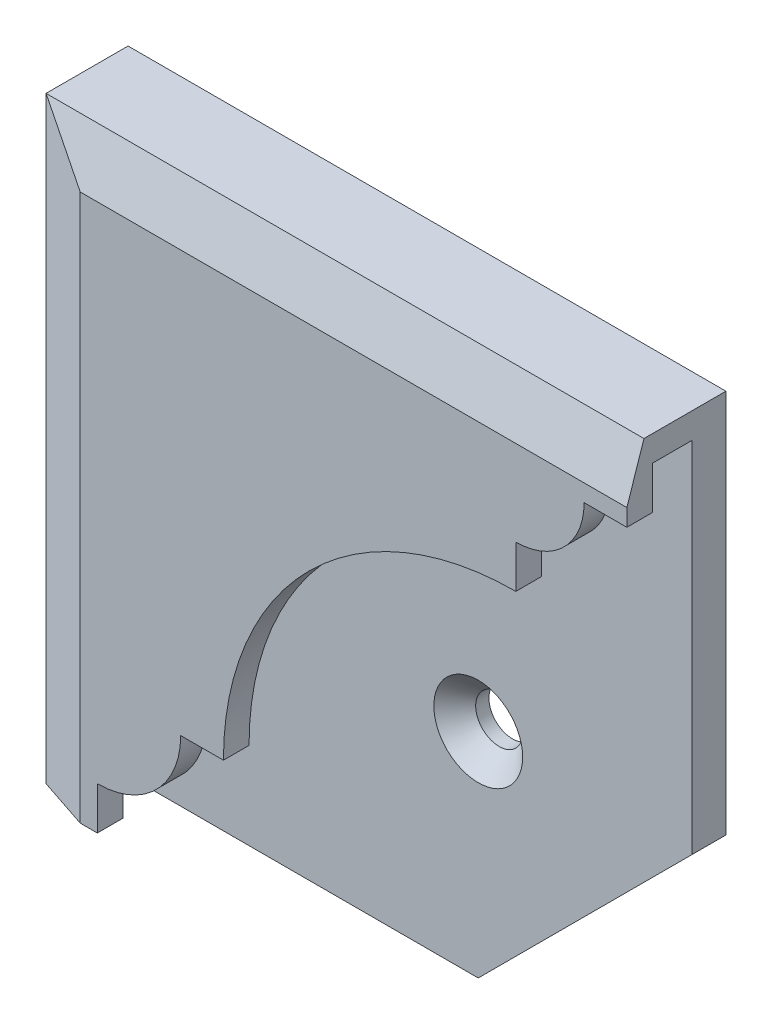
ISO-10303-21;
HEADER;
FILE_DESCRIPTION(('STEP AP214'),'2;1');
FILE_NAME('part.step','',(''),(''),'','','');
FILE_SCHEMA(('AUTOMOTIVE_DESIGN { 1 0 10303 214 1 1 1 1 }'));
ENDSEC;
DATA;
#1=APPLICATION_CONTEXT('core data for automotive mechanical design processes');
#2=APPLICATION_PROTOCOL_DEFINITION('international standard','automotive_design',2000,#1);
#3=PRODUCT_CONTEXT('',#1,'mechanical');
#4=PRODUCT('Part','Part','',(#3));
#5=PRODUCT_RELATED_PRODUCT_CATEGORY('part','',(#4));
#6=PRODUCT_DEFINITION_FORMATION('','',#4);
#7=PRODUCT_DEFINITION_CONTEXT('part definition',#1,'design');
#8=PRODUCT_DEFINITION('design','',#6,#7);
#9=PRODUCT_DEFINITION_SHAPE('','',#8);
#10=(LENGTH_UNIT() NAMED_UNIT(*) SI_UNIT(.MILLI.,.METRE.));
#11=(NAMED_UNIT(*) PLANE_ANGLE_UNIT() SI_UNIT($,.RADIAN.));
#12=(NAMED_UNIT(*) SI_UNIT($,.STERADIAN.) SOLID_ANGLE_UNIT());
#13=UNCERTAINTY_MEASURE_WITH_UNIT(LENGTH_MEASURE(1.E-05),#10,'distance_accuracy_value','');
#14=(GEOMETRIC_REPRESENTATION_CONTEXT(3) GLOBAL_UNCERTAINTY_ASSIGNED_CONTEXT((#13)) GLOBAL_UNIT_ASSIGNED_CONTEXT((#10,
#11,#12)) REPRESENTATION_CONTEXT('',''));
#15=CARTESIAN_POINT('',(0.,0.,0.));
#16=DIRECTION('',(0.,0.,1.));
#17=DIRECTION('',(1.,0.,0.));
#18=AXIS2_PLACEMENT_3D('',#15,#16,#17);
#19=CARTESIAN_POINT('',(0.,0.,4.));
#20=DIRECTION('',(0.,0.,-1.));
#21=DIRECTION('',(-1.,0.,0.));
#22=AXIS2_PLACEMENT_3D('',#19,#20,#21);
#23=PLANE('',#22);
#24=CARTESIAN_POINT('',(9.99999999999997,-10.,4.));
#25=DIRECTION('',(0.,0.,1.));
#26=DIRECTION('',(1.,0.,0.));
#27=AXIS2_PLACEMENT_3D('',#24,#25,#26);
#28=CIRCLE('',#27,5.2);
#29=CARTESIAN_POINT('',(15.2,-10.,4.));
#30=VERTEX_POINT('',#29);
#31=EDGE_CURVE('E350',#30,#30,#28,.T.);
#32=ORIENTED_EDGE('',*,*,#31,.F.);
#33=EDGE_LOOP('',(#32));
#34=FACE_BOUND('',#33,.T.);
#35=DIRECTION('',(1.,0.,0.));
#36=VECTOR('',#35,1.);
#37=CARTESIAN_POINT('',(-35.,-35.,4.));
#38=LINE('',#37,#36);
#39=CARTESIAN_POINT('',(-32.,-35.,4.));
#40=VERTEX_POINT('',#39);
#41=CARTESIAN_POINT('',(9.99999999999989,-35.,4.));
#42=VERTEX_POINT('',#41);
#43=EDGE_CURVE('E244',#40,#42,#38,.T.);
#44=ORIENTED_EDGE('',*,*,#43,.T.);
#45=DIRECTION('',(-0.707106781186549,-0.707106781186546,0.));
#46=VECTOR('',#45,1.);
#47=CARTESIAN_POINT('',(35.,-10.,4.));
#48=LINE('',#47,#46);
#49=CARTESIAN_POINT('',(35.,-10.,4.));
#50=VERTEX_POINT('',#49);
#51=EDGE_CURVE('E11',#42,#50,#48,.F.);
#52=ORIENTED_EDGE('',*,*,#51,.T.);
#53=DIRECTION('',(0.,1.,0.));
#54=VECTOR('',#53,1.);
#55=CARTESIAN_POINT('',(35.,-35.,4.));
#56=LINE('',#55,#54);
#57=CARTESIAN_POINT('',(35.,32.,4.));
#58=VERTEX_POINT('',#57);
#59=EDGE_CURVE('E241',#50,#58,#56,.T.);
#60=ORIENTED_EDGE('',*,*,#59,.T.);
#61=DIRECTION('',(1.,0.,0.));
#62=VECTOR('',#61,1.);
#63=CARTESIAN_POINT('',(-32.,32.,4.));
#64=LINE('',#63,#62);
#65=CARTESIAN_POINT('',(-32.,32.,4.));
#66=VERTEX_POINT('',#65);
#67=EDGE_CURVE('E222',#66,#58,#64,.T.);
#68=ORIENTED_EDGE('',*,*,#67,.F.);
#69=DIRECTION('',(0.,1.,0.));
#70=VECTOR('',#69,1.);
#71=CARTESIAN_POINT('',(-32.,-35.,4.));
#72=LINE('',#71,#70);
#73=EDGE_CURVE('E173',#40,#66,#72,.T.);
#74=ORIENTED_EDGE('',*,*,#73,.F.);
#75=EDGE_LOOP('',(#44,#52,#60,#68,#74));
#76=FACE_BOUND('',#75,.T.);
#77=ADVANCED_FACE('F34',(#34,#76),#23,.F.);
#78=CARTESIAN_POINT('',(35.,-35.,4.));
#79=DIRECTION('',(-1.,0.,0.));
#80=DIRECTION('',(0.,0.,1.));
#81=AXIS2_PLACEMENT_3D('',#78,#79,#80);
#82=PLANE('',#81);
#83=ORIENTED_EDGE('',*,*,#59,.F.);
#84=DIRECTION('',(0.,0.,-1.));
#85=VECTOR('',#84,1.);
#86=CARTESIAN_POINT('',(35.,-10.,4.));
#87=LINE('',#86,#85);
#88=CARTESIAN_POINT('',(35.,-10.,0.));
#89=VERTEX_POINT('',#88);
#90=EDGE_CURVE('E237',#50,#89,#87,.T.);
#91=ORIENTED_EDGE('',*,*,#90,.T.);
#92=DIRECTION('',(0.,1.,0.));
#93=VECTOR('',#92,1.);
#94=CARTESIAN_POINT('',(35.,-35.,0.));
#95=LINE('',#94,#93);
#96=CARTESIAN_POINT('',(35.,35.,0.));
#97=VERTEX_POINT('',#96);
#98=EDGE_CURVE('E252',#89,#97,#95,.T.);
#99=ORIENTED_EDGE('',*,*,#98,.T.);
#100=DIRECTION('',(0.,0.,-1.));
#101=VECTOR('',#100,1.);
#102=CARTESIAN_POINT('',(35.,35.,4.));
#103=LINE('',#102,#101);
#104=CARTESIAN_POINT('',(35.,35.,9.59999999999999));
#105=VERTEX_POINT('',#104);
#106=EDGE_CURVE('E227',#105,#97,#103,.T.);
#107=ORIENTED_EDGE('',*,*,#106,.F.);
#108=DIRECTION('',(0.,0.948683298050515,-0.316227766016836));
#109=VECTOR('',#108,1.);
#110=CARTESIAN_POINT('',(35.,28.9999999999999,11.6));
#111=LINE('',#110,#109);
#112=CARTESIAN_POINT('',(35.,28.9999999999999,11.6));
#113=VERTEX_POINT('',#112);
#114=EDGE_CURVE('E235',#105,#113,#111,.F.);
#115=ORIENTED_EDGE('',*,*,#114,.T.);
#116=DIRECTION('',(0.,1.,0.));
#117=VECTOR('',#116,1.);
#118=CARTESIAN_POINT('',(35.,35.,11.6));
#119=LINE('',#118,#117);
#120=CARTESIAN_POINT('',(35.,27.,11.6));
#121=VERTEX_POINT('',#120);
#122=EDGE_CURVE('E164',#121,#113,#119,.T.);
#123=ORIENTED_EDGE('',*,*,#122,.F.);
#124=DIRECTION('',(0.,0.,-1.));
#125=VECTOR('',#124,1.);
#126=CARTESIAN_POINT('',(35.,27.,11.6));
#127=LINE('',#126,#125);
#128=CARTESIAN_POINT('',(35.,27.,8.6));
#129=VERTEX_POINT('',#128);
#130=EDGE_CURVE('E194',#121,#129,#127,.T.);
#131=ORIENTED_EDGE('',*,*,#130,.T.);
#132=DIRECTION('',(0.,1.,0.));
#133=VECTOR('',#132,1.);
#134=CARTESIAN_POINT('',(35.,35.,8.6));
#135=LINE('',#134,#133);
#136=CARTESIAN_POINT('',(35.,32.,8.6));
#137=VERTEX_POINT('',#136);
#138=EDGE_CURVE('E200',#129,#137,#135,.T.);
#139=ORIENTED_EDGE('',*,*,#138,.T.);
#140=DIRECTION('',(0.,0.,-1.));
#141=VECTOR('',#140,1.);
#142=CARTESIAN_POINT('',(35.,32.,8.6));
#143=LINE('',#142,#141);
#144=EDGE_CURVE('E216',#137,#58,#143,.T.);
#145=ORIENTED_EDGE('',*,*,#144,.T.);
#146=EDGE_LOOP('',(#83,#91,#99,#107,#115,#123,#131,#139,#145));
#147=FACE_BOUND('',#146,.T.);
#148=ADVANCED_FACE('F283',(#147),#82,.F.);
#149=CARTESIAN_POINT('',(-35.,35.,4.));
#150=DIRECTION('',(0.,-1.,0.));
#151=DIRECTION('',(0.,0.,-1.));
#152=AXIS2_PLACEMENT_3D('',#149,#150,#151);
#153=PLANE('',#152);
#154=DIRECTION('',(0.,0.,-1.));
#155=VECTOR('',#154,1.);
#156=CARTESIAN_POINT('',(-35.,35.,4.));
#157=LINE('',#156,#155);
#158=CARTESIAN_POINT('',(-35.,35.,9.59999999999999));
#159=VERTEX_POINT('',#158);
#160=CARTESIAN_POINT('',(-35.,35.,0.));
#161=VERTEX_POINT('',#160);
#162=EDGE_CURVE('E590',#159,#161,#157,.T.);
#163=ORIENTED_EDGE('',*,*,#162,.F.);
#164=DIRECTION('',(1.,0.,0.));
#165=VECTOR('',#164,1.);
#166=CARTESIAN_POINT('',(-35.,35.,9.59999999999999));
#167=LINE('',#166,#165);
#168=EDGE_CURVE('E233',#159,#105,#167,.T.);
#169=ORIENTED_EDGE('',*,*,#168,.T.);
#170=ORIENTED_EDGE('',*,*,#106,.T.);
#171=DIRECTION('',(-1.,0.,0.));
#172=VECTOR('',#171,1.);
#173=CARTESIAN_POINT('',(-35.,35.,0.));
#174=LINE('',#173,#172);
#175=EDGE_CURVE('E583',#97,#161,#174,.T.);
#176=ORIENTED_EDGE('',*,*,#175,.T.);
#177=EDGE_LOOP('',(#163,#169,#170,#176));
#178=FACE_BOUND('',#177,.T.);
#179=ADVANCED_FACE('F305',(#178),#153,.F.);
#180=CARTESIAN_POINT('',(-35.,-35.,4.));
#181=DIRECTION('',(1.,0.,0.));
#182=DIRECTION('',(0.,0.,-1.));
#183=AXIS2_PLACEMENT_3D('',#180,#181,#182);
#184=PLANE('',#183);
#185=DIRECTION('',(0.,0.,-1.));
#186=VECTOR('',#185,1.);
#187=CARTESIAN_POINT('',(-35.,-35.,4.));
#188=LINE('',#187,#186);
#189=CARTESIAN_POINT('',(-35.,-35.,9.59999999999999));
#190=VERTEX_POINT('',#189);
#191=CARTESIAN_POINT('',(-35.,-35.,0.));
#192=VERTEX_POINT('',#191);
#193=EDGE_CURVE('E257',#190,#192,#188,.T.);
#194=ORIENTED_EDGE('',*,*,#193,.F.);
#195=DIRECTION('',(0.,1.,0.));
#196=VECTOR('',#195,1.);
#197=CARTESIAN_POINT('',(-35.,-35.,9.59999999999999));
#198=LINE('',#197,#196);
#199=EDGE_CURVE('E231',#190,#159,#198,.T.);
#200=ORIENTED_EDGE('',*,*,#199,.T.);
#201=ORIENTED_EDGE('',*,*,#162,.T.);
#202=DIRECTION('',(0.,-1.,0.));
#203=VECTOR('',#202,1.);
#204=CARTESIAN_POINT('',(-35.,-35.,0.));
#205=LINE('',#204,#203);
#206=EDGE_CURVE('E584',#161,#192,#205,.T.);
#207=ORIENTED_EDGE('',*,*,#206,.T.);
#208=EDGE_LOOP('',(#194,#200,#201,#207));
#209=FACE_BOUND('',#208,.T.);
#210=ADVANCED_FACE('F316',(#209),#184,.F.);
#211=CARTESIAN_POINT('',(-35.,-35.,4.));
#212=DIRECTION('',(0.,1.,0.));
#213=DIRECTION('',(0.,0.,1.));
#214=AXIS2_PLACEMENT_3D('',#211,#212,#213);
#215=PLANE('',#214);
#216=DIRECTION('',(1.,0.,0.));
#217=VECTOR('',#216,1.);
#218=CARTESIAN_POINT('',(-35.,-35.,0.));
#219=LINE('',#218,#217);
#220=CARTESIAN_POINT('',(9.99999999999988,-35.,0.));
#221=VERTEX_POINT('',#220);
#222=EDGE_CURVE('E245',#192,#221,#219,.T.);
#223=ORIENTED_EDGE('',*,*,#222,.T.);
#224=DIRECTION('',(0.,0.,1.));
#225=VECTOR('',#224,1.);
#226=CARTESIAN_POINT('',(9.99999999999988,-35.,4.));
#227=LINE('',#226,#225);
#228=EDGE_CURVE('E42',#221,#42,#227,.T.);
#229=ORIENTED_EDGE('',*,*,#228,.T.);
#230=ORIENTED_EDGE('',*,*,#43,.F.);
#231=DIRECTION('',(0.,0.,-1.));
#232=VECTOR('',#231,1.);
#233=CARTESIAN_POINT('',(-32.,-35.,8.6));
#234=LINE('',#233,#232);
#235=CARTESIAN_POINT('',(-32.,-35.,8.6));
#236=VERTEX_POINT('',#235);
#237=EDGE_CURVE('E263',#236,#40,#234,.T.);
#238=ORIENTED_EDGE('',*,*,#237,.F.);
#239=DIRECTION('',(1.,0.,0.));
#240=VECTOR('',#239,1.);
#241=CARTESIAN_POINT('',(-27.,-35.,8.6));
#242=LINE('',#241,#240);
#243=CARTESIAN_POINT('',(-27.,-35.,8.6));
#244=VERTEX_POINT('',#243);
#245=EDGE_CURVE('E170',#236,#244,#242,.T.);
#246=ORIENTED_EDGE('',*,*,#245,.T.);
#247=DIRECTION('',(0.,0.,-1.));
#248=VECTOR('',#247,1.);
#249=CARTESIAN_POINT('',(-27.,-35.,11.6));
#250=LINE('',#249,#248);
#251=CARTESIAN_POINT('',(-27.,-35.,11.6));
#252=VERTEX_POINT('',#251);
#253=EDGE_CURVE('E167',#252,#244,#250,.T.);
#254=ORIENTED_EDGE('',*,*,#253,.F.);
#255=DIRECTION('',(1.,0.,0.));
#256=VECTOR('',#255,1.);
#257=CARTESIAN_POINT('',(-27.,-35.,11.6));
#258=LINE('',#257,#256);
#259=CARTESIAN_POINT('',(-28.9999999999999,-35.,11.6));
#260=VERTEX_POINT('',#259);
#261=EDGE_CURVE('E156',#260,#252,#258,.T.);
#262=ORIENTED_EDGE('',*,*,#261,.F.);
#263=DIRECTION('',(0.948683298050515,0.,0.316227766016835));
#264=VECTOR('',#263,1.);
#265=CARTESIAN_POINT('',(-28.9999999999999,-35.,11.6));
#266=LINE('',#265,#264);
#267=EDGE_CURVE('E229',#260,#190,#266,.F.);
#268=ORIENTED_EDGE('',*,*,#267,.T.);
#269=ORIENTED_EDGE('',*,*,#193,.T.);
#270=EDGE_LOOP('',(#223,#229,#230,#238,#246,#254,#262,#268,#269));
#271=FACE_BOUND('',#270,.T.);
#272=ADVANCED_FACE('F168',(#271),#215,.F.);
#273=CARTESIAN_POINT('',(0.,0.,0.));
#274=DIRECTION('',(0.,0.,-1.));
#275=DIRECTION('',(-1.,0.,0.));
#276=AXIS2_PLACEMENT_3D('',#273,#274,#275);
#277=PLANE('',#276);
#278=CARTESIAN_POINT('',(9.99999999999997,-10.,0.));
#279=DIRECTION('',(0.,0.,-1.));
#280=DIRECTION('',(-1.,0.,0.));
#281=AXIS2_PLACEMENT_3D('',#278,#279,#280);
#282=CIRCLE('',#281,2.75);
#283=CARTESIAN_POINT('',(7.24999999999998,-10.,0.));
#284=VERTEX_POINT('',#283);
#285=EDGE_CURVE('E240',#284,#284,#282,.T.);
#286=ORIENTED_EDGE('',*,*,#285,.F.);
#287=EDGE_LOOP('',(#286));
#288=FACE_BOUND('',#287,.T.);
#289=ORIENTED_EDGE('',*,*,#98,.F.);
#290=DIRECTION('',(0.707106781186549,0.707106781186546,0.));
#291=VECTOR('',#290,1.);
#292=CARTESIAN_POINT('',(22.4999999999999,-22.5,0.));
#293=LINE('',#292,#291);
#294=EDGE_CURVE('E56',#89,#221,#293,.F.);
#295=ORIENTED_EDGE('',*,*,#294,.T.);
#296=ORIENTED_EDGE('',*,*,#222,.F.);
#297=ORIENTED_EDGE('',*,*,#206,.F.);
#298=ORIENTED_EDGE('',*,*,#175,.F.);
#299=EDGE_LOOP('',(#289,#295,#296,#297,#298));
#300=FACE_BOUND('',#299,.T.);
#301=ADVANCED_FACE('F311',(#288,#300),#277,.T.);
#302=CARTESIAN_POINT('',(-32.,-35.,8.6));
#303=DIRECTION('',(-1.,0.,0.));
#304=DIRECTION('',(0.,-1.,0.));
#305=AXIS2_PLACEMENT_3D('',#302,#303,#304);
#306=PLANE('',#305);
#307=ORIENTED_EDGE('',*,*,#73,.T.);
#308=DIRECTION('',(0.,0.,-1.));
#309=VECTOR('',#308,1.);
#310=CARTESIAN_POINT('',(-32.,32.,8.6));
#311=LINE('',#310,#309);
#312=CARTESIAN_POINT('',(-32.,32.,8.6));
#313=VERTEX_POINT('',#312);
#314=EDGE_CURVE('E249',#313,#66,#311,.T.);
#315=ORIENTED_EDGE('',*,*,#314,.F.);
#316=DIRECTION('',(0.,1.,0.));
#317=VECTOR('',#316,1.);
#318=CARTESIAN_POINT('',(-32.,-35.,8.6));
#319=LINE('',#318,#317);
#320=EDGE_CURVE('E217',#236,#313,#319,.T.);
#321=ORIENTED_EDGE('',*,*,#320,.F.);
#322=ORIENTED_EDGE('',*,*,#237,.T.);
#323=EDGE_LOOP('',(#307,#315,#321,#322));
#324=FACE_BOUND('',#323,.T.);
#325=ADVANCED_FACE('F278',(#324),#306,.F.);
#326=CARTESIAN_POINT('',(-32.,32.,8.6));
#327=DIRECTION('',(0.,1.,0.));
#328=DIRECTION('',(0.,0.,1.));
#329=AXIS2_PLACEMENT_3D('',#326,#327,#328);
#330=PLANE('',#329);
#331=ORIENTED_EDGE('',*,*,#67,.T.);
#332=ORIENTED_EDGE('',*,*,#144,.F.);
#333=DIRECTION('',(1.,0.,0.));
#334=VECTOR('',#333,1.);
#335=CARTESIAN_POINT('',(-32.,32.,8.6));
#336=LINE('',#335,#334);
#337=EDGE_CURVE('E212',#313,#137,#336,.T.);
#338=ORIENTED_EDGE('',*,*,#337,.F.);
#339=ORIENTED_EDGE('',*,*,#314,.T.);
#340=EDGE_LOOP('',(#331,#332,#338,#339));
#341=FACE_BOUND('',#340,.T.);
#342=ADVANCED_FACE('F275',(#341),#330,.F.);
#343=CARTESIAN_POINT('',(-27.,-30.,11.6));
#344=DIRECTION('',(-1.,0.,0.));
#345=DIRECTION('',(0.,-1.,0.));
#346=AXIS2_PLACEMENT_3D('',#343,#344,#345);
#347=PLANE('',#346);
#348=DIRECTION('',(0.,1.,0.));
#349=VECTOR('',#348,1.);
#350=CARTESIAN_POINT('',(-27.,-30.,8.6));
#351=LINE('',#350,#349);
#352=CARTESIAN_POINT('',(-27.,-30.,8.6));
#353=VERTEX_POINT('',#352);
#354=EDGE_CURVE('E206',#244,#353,#351,.T.);
#355=ORIENTED_EDGE('',*,*,#354,.T.);
#356=DIRECTION('',(0.,0.,-1.));
#357=VECTOR('',#356,1.);
#358=CARTESIAN_POINT('',(-27.,-30.,11.6));
#359=LINE('',#358,#357);
#360=CARTESIAN_POINT('',(-27.,-30.,11.6));
#361=VERTEX_POINT('',#360);
#362=EDGE_CURVE('E174',#361,#353,#359,.T.);
#363=ORIENTED_EDGE('',*,*,#362,.F.);
#364=DIRECTION('',(0.,1.,0.));
#365=VECTOR('',#364,1.);
#366=CARTESIAN_POINT('',(-27.,-30.,11.6));
#367=LINE('',#366,#365);
#368=EDGE_CURVE('E160',#252,#361,#367,.T.);
#369=ORIENTED_EDGE('',*,*,#368,.F.);
#370=ORIENTED_EDGE('',*,*,#253,.T.);
#371=EDGE_LOOP('',(#355,#363,#369,#370));
#372=FACE_BOUND('',#371,.T.);
#373=ADVANCED_FACE('F176',(#372),#347,.F.);
#374=CARTESIAN_POINT('',(-27.,-20.2350157811186,11.6));
#375=DIRECTION('',(0.,0.,-1.));
#376=DIRECTION('',(-1.,0.,0.));
#377=AXIS2_PLACEMENT_3D('',#374,#375,#376);
#378=CYLINDRICAL_SURFACE('',#377,9.76498421888135);
#379=CARTESIAN_POINT('',(-27.,-20.2350157811186,8.6));
#380=DIRECTION('',(0.,0.,1.));
#381=DIRECTION('',(-1.,0.,0.));
#382=AXIS2_PLACEMENT_3D('',#379,#380,#381);
#383=CIRCLE('',#382,9.76498421888135);
#384=CARTESIAN_POINT('',(-17.2350157811187,-20.2350157811186,8.6));
#385=VERTEX_POINT('',#384);
#386=EDGE_CURVE('E539',#353,#385,#383,.T.);
#387=ORIENTED_EDGE('',*,*,#386,.T.);
#388=DIRECTION('',(0.,0.,-1.));
#389=VECTOR('',#388,1.);
#390=CARTESIAN_POINT('',(-17.2350157811187,-20.2350157811186,11.6));
#391=LINE('',#390,#389);
#392=CARTESIAN_POINT('',(-17.2350157811187,-20.2350157811186,11.6));
#393=VERTEX_POINT('',#392);
#394=EDGE_CURVE('E541',#393,#385,#391,.T.);
#395=ORIENTED_EDGE('',*,*,#394,.F.);
#396=CARTESIAN_POINT('',(-27.,-20.2350157811186,11.6));
#397=DIRECTION('',(0.,0.,1.));
#398=DIRECTION('',(-1.,0.,0.));
#399=AXIS2_PLACEMENT_3D('',#396,#397,#398);
#400=CIRCLE('',#399,9.76498421888135);
#401=EDGE_CURVE('E179',#361,#393,#400,.T.);
#402=ORIENTED_EDGE('',*,*,#401,.F.);
#403=ORIENTED_EDGE('',*,*,#362,.T.);
#404=EDGE_LOOP('',(#387,#395,#402,#403));
#405=FACE_BOUND('',#404,.T.);
#406=ADVANCED_FACE('F381',(#405),#378,.T.);
#407=CARTESIAN_POINT('',(-12.2350157811187,-20.2350157811186,11.6));
#408=DIRECTION('',(0.,1.,0.));
#409=DIRECTION('',(0.,0.,1.));
#410=AXIS2_PLACEMENT_3D('',#407,#408,#409);
#411=PLANE('',#410);
#412=DIRECTION('',(1.,0.,0.));
#413=VECTOR('',#412,1.);
#414=CARTESIAN_POINT('',(-12.2350157811187,-20.2350157811186,8.6));
#415=LINE('',#414,#413);
#416=CARTESIAN_POINT('',(-12.2350157811187,-20.2350157811186,8.6));
#417=VERTEX_POINT('',#416);
#418=EDGE_CURVE('E544',#385,#417,#415,.T.);
#419=ORIENTED_EDGE('',*,*,#418,.T.);
#420=DIRECTION('',(0.,0.,-1.));
#421=VECTOR('',#420,1.);
#422=CARTESIAN_POINT('',(-12.2350157811187,-20.2350157811186,11.6));
#423=LINE('',#422,#421);
#424=CARTESIAN_POINT('',(-12.2350157811187,-20.2350157811186,11.6));
#425=VERTEX_POINT('',#424);
#426=EDGE_CURVE('E548',#425,#417,#423,.T.);
#427=ORIENTED_EDGE('',*,*,#426,.F.);
#428=DIRECTION('',(1.,0.,0.));
#429=VECTOR('',#428,1.);
#430=CARTESIAN_POINT('',(-12.2350157811187,-20.2350157811186,11.6));
#431=LINE('',#430,#429);
#432=EDGE_CURVE('E181',#393,#425,#431,.T.);
#433=ORIENTED_EDGE('',*,*,#432,.F.);
#434=ORIENTED_EDGE('',*,*,#394,.T.);
#435=EDGE_LOOP('',(#419,#427,#433,#434));
#436=FACE_BOUND('',#435,.T.);
#437=ADVANCED_FACE('F377',(#436),#411,.F.);
#438=CARTESIAN_POINT('',(22.,-20.2350157811186,11.6));
#439=DIRECTION('',(0.,0.,-1.));
#440=DIRECTION('',(-1.,0.,0.));
#441=AXIS2_PLACEMENT_3D('',#438,#439,#440);
#442=CYLINDRICAL_SURFACE('',#441,34.2350157811186);
#443=CARTESIAN_POINT('',(22.,-20.2350157811186,8.6));
#444=DIRECTION('',(0.,0.,-1.));
#445=DIRECTION('',(1.,0.,0.));
#446=AXIS2_PLACEMENT_3D('',#443,#444,#445);
#447=CIRCLE('',#446,34.2350157811186);
#448=CARTESIAN_POINT('',(22.,14.,8.6));
#449=VERTEX_POINT('',#448);
#450=EDGE_CURVE('E552',#417,#449,#447,.T.);
#451=ORIENTED_EDGE('',*,*,#450,.T.);
#452=DIRECTION('',(0.,0.,-1.));
#453=VECTOR('',#452,1.);
#454=CARTESIAN_POINT('',(22.,14.,11.6));
#455=LINE('',#454,#453);
#456=CARTESIAN_POINT('',(22.,14.,11.6));
#457=VERTEX_POINT('',#456);
#458=EDGE_CURVE('E566',#457,#449,#455,.T.);
#459=ORIENTED_EDGE('',*,*,#458,.F.);
#460=CARTESIAN_POINT('',(22.,-20.2350157811186,11.6));
#461=DIRECTION('',(0.,0.,-1.));
#462=DIRECTION('',(1.,0.,0.));
#463=AXIS2_PLACEMENT_3D('',#460,#461,#462);
#464=CIRCLE('',#463,34.2350157811186);
#465=EDGE_CURVE('E186',#425,#457,#464,.T.);
#466=ORIENTED_EDGE('',*,*,#465,.F.);
#467=ORIENTED_EDGE('',*,*,#426,.T.);
#468=EDGE_LOOP('',(#451,#459,#466,#467));
#469=FACE_BOUND('',#468,.T.);
#470=ADVANCED_FACE('F373',(#469),#442,.F.);
#471=CARTESIAN_POINT('',(22.,19.,11.6));
#472=DIRECTION('',(-1.,0.,0.));
#473=DIRECTION('',(0.,0.,1.));
#474=AXIS2_PLACEMENT_3D('',#471,#472,#473);
#475=PLANE('',#474);
#476=DIRECTION('',(0.,1.,0.));
#477=VECTOR('',#476,1.);
#478=CARTESIAN_POINT('',(22.,19.,8.6));
#479=LINE('',#478,#477);
#480=CARTESIAN_POINT('',(22.,19.,8.6));
#481=VERTEX_POINT('',#480);
#482=EDGE_CURVE('E554',#449,#481,#479,.T.);
#483=ORIENTED_EDGE('',*,*,#482,.T.);
#484=DIRECTION('',(0.,0.,-1.));
#485=VECTOR('',#484,1.);
#486=CARTESIAN_POINT('',(22.,19.,11.6));
#487=LINE('',#486,#485);
#488=CARTESIAN_POINT('',(22.,19.,11.6));
#489=VERTEX_POINT('',#488);
#490=EDGE_CURVE('E563',#489,#481,#487,.T.);
#491=ORIENTED_EDGE('',*,*,#490,.F.);
#492=DIRECTION('',(0.,1.,0.));
#493=VECTOR('',#492,1.);
#494=CARTESIAN_POINT('',(22.,19.,11.6));
#495=LINE('',#494,#493);
#496=EDGE_CURVE('E188',#457,#489,#495,.T.);
#497=ORIENTED_EDGE('',*,*,#496,.F.);
#498=ORIENTED_EDGE('',*,*,#458,.T.);
#499=EDGE_LOOP('',(#483,#491,#497,#498));
#500=FACE_BOUND('',#499,.T.);
#501=ADVANCED_FACE('F369',(#500),#475,.F.);
#502=CARTESIAN_POINT('',(22.,27.,11.6));
#503=DIRECTION('',(0.,0.,-1.));
#504=DIRECTION('',(-1.,0.,0.));
#505=AXIS2_PLACEMENT_3D('',#502,#503,#504);
#506=CYLINDRICAL_SURFACE('',#505,8.);
#507=CARTESIAN_POINT('',(22.,27.,8.6));
#508=DIRECTION('',(0.,0.,1.));
#509=DIRECTION('',(-1.,0.,0.));
#510=AXIS2_PLACEMENT_3D('',#507,#508,#509);
#511=CIRCLE('',#510,8.);
#512=CARTESIAN_POINT('',(30.,27.,8.6));
#513=VERTEX_POINT('',#512);
#514=EDGE_CURVE('E342',#481,#513,#511,.T.);
#515=ORIENTED_EDGE('',*,*,#514,.T.);
#516=DIRECTION('',(0.,0.,-1.));
#517=VECTOR('',#516,1.);
#518=CARTESIAN_POINT('',(30.,27.,11.6));
#519=LINE('',#518,#517);
#520=CARTESIAN_POINT('',(30.,27.,11.6));
#521=VERTEX_POINT('',#520);
#522=EDGE_CURVE('E560',#521,#513,#519,.T.);
#523=ORIENTED_EDGE('',*,*,#522,.F.);
#524=CARTESIAN_POINT('',(22.,27.,11.6));
#525=DIRECTION('',(0.,0.,1.));
#526=DIRECTION('',(-1.,0.,0.));
#527=AXIS2_PLACEMENT_3D('',#524,#525,#526);
#528=CIRCLE('',#527,8.);
#529=EDGE_CURVE('E190',#489,#521,#528,.T.);
#530=ORIENTED_EDGE('',*,*,#529,.F.);
#531=ORIENTED_EDGE('',*,*,#490,.T.);
#532=EDGE_LOOP('',(#515,#523,#530,#531));
#533=FACE_BOUND('',#532,.T.);
#534=ADVANCED_FACE('F365',(#533),#506,.T.);
#535=CARTESIAN_POINT('',(35.,27.,11.6));
#536=DIRECTION('',(0.,1.,0.));
#537=DIRECTION('',(-1.,0.,0.));
#538=AXIS2_PLACEMENT_3D('',#535,#536,#537);
#539=PLANE('',#538);
#540=DIRECTION('',(1.,0.,0.));
#541=VECTOR('',#540,1.);
#542=CARTESIAN_POINT('',(35.,27.,8.6));
#543=LINE('',#542,#541);
#544=EDGE_CURVE('E341',#513,#129,#543,.T.);
#545=ORIENTED_EDGE('',*,*,#544,.T.);
#546=ORIENTED_EDGE('',*,*,#130,.F.);
#547=DIRECTION('',(1.,0.,0.));
#548=VECTOR('',#547,1.);
#549=CARTESIAN_POINT('',(35.,27.,11.6));
#550=LINE('',#549,#548);
#551=EDGE_CURVE('E192',#521,#121,#550,.T.);
#552=ORIENTED_EDGE('',*,*,#551,.F.);
#553=ORIENTED_EDGE('',*,*,#522,.T.);
#554=EDGE_LOOP('',(#545,#546,#552,#553));
#555=FACE_BOUND('',#554,.T.);
#556=ADVANCED_FACE('F361',(#555),#539,.F.);
#557=CARTESIAN_POINT('',(22.,27.,11.6));
#558=DIRECTION('',(0.,0.,-1.));
#559=DIRECTION('',(-1.,0.,0.));
#560=AXIS2_PLACEMENT_3D('',#557,#558,#559);
#561=PLANE('',#560);
#562=DIRECTION('',(-1.,0.,0.));
#563=VECTOR('',#562,1.);
#564=CARTESIAN_POINT('',(22.,28.9999999999999,11.6));
#565=LINE('',#564,#563);
#566=CARTESIAN_POINT('',(-28.9999999999999,28.9999999999999,11.6));
#567=VERTEX_POINT('',#566);
#568=EDGE_CURVE('E225',#113,#567,#565,.T.);
#569=ORIENTED_EDGE('',*,*,#568,.T.);
#570=DIRECTION('',(0.,-1.,0.));
#571=VECTOR('',#570,1.);
#572=CARTESIAN_POINT('',(-28.9999999999999,27.,11.6));
#573=LINE('',#572,#571);
#574=EDGE_CURVE('E163',#567,#260,#573,.T.);
#575=ORIENTED_EDGE('',*,*,#574,.T.);
#576=ORIENTED_EDGE('',*,*,#261,.T.);
#577=ORIENTED_EDGE('',*,*,#368,.T.);
#578=ORIENTED_EDGE('',*,*,#401,.T.);
#579=ORIENTED_EDGE('',*,*,#432,.T.);
#580=ORIENTED_EDGE('',*,*,#465,.T.);
#581=ORIENTED_EDGE('',*,*,#496,.T.);
#582=ORIENTED_EDGE('',*,*,#529,.T.);
#583=ORIENTED_EDGE('',*,*,#551,.T.);
#584=ORIENTED_EDGE('',*,*,#122,.T.);
#585=EDGE_LOOP('',(#569,#575,#576,#577,#578,#579,#580,#581,#582,#583,#584));
#586=FACE_BOUND('',#585,.T.);
#587=ADVANCED_FACE('F158',(#586),#561,.F.);
#588=CARTESIAN_POINT('',(22.,27.,8.6));
#589=DIRECTION('',(0.,0.,-1.));
#590=DIRECTION('',(-1.,0.,0.));
#591=AXIS2_PLACEMENT_3D('',#588,#589,#590);
#592=PLANE('',#591);
#593=ORIENTED_EDGE('',*,*,#245,.F.);
#594=ORIENTED_EDGE('',*,*,#320,.T.);
#595=ORIENTED_EDGE('',*,*,#337,.T.);
#596=ORIENTED_EDGE('',*,*,#138,.F.);
#597=ORIENTED_EDGE('',*,*,#544,.F.);
#598=ORIENTED_EDGE('',*,*,#514,.F.);
#599=ORIENTED_EDGE('',*,*,#482,.F.);
#600=ORIENTED_EDGE('',*,*,#450,.F.);
#601=ORIENTED_EDGE('',*,*,#418,.F.);
#602=ORIENTED_EDGE('',*,*,#386,.F.);
#603=ORIENTED_EDGE('',*,*,#354,.F.);
#604=EDGE_LOOP('',(#593,#594,#595,#596,#597,#598,#599,#600,#601,#602,#603));
#605=FACE_BOUND('',#604,.T.);
#606=ADVANCED_FACE('F323',(#605),#592,.T.);
#607=CARTESIAN_POINT('',(22.,28.9999999999999,11.6));
#608=DIRECTION('',(0.,-0.316227766016836,-0.948683298050515));
#609=DIRECTION('',(-1.,0.,0.));
#610=AXIS2_PLACEMENT_3D('',#607,#608,#609);
#611=PLANE('',#610);
#612=ORIENTED_EDGE('',*,*,#114,.F.);
#613=ORIENTED_EDGE('',*,*,#168,.F.);
#614=DIRECTION('',(0.688247201611686,-0.688247201611686,0.22941573387056));
#615=VECTOR('',#614,1.);
#616=CARTESIAN_POINT('',(-4.84210526315785,4.84210526315784,19.6526315789473));
#617=LINE('',#616,#615);
#618=EDGE_CURVE('E203',#567,#159,#617,.F.);
#619=ORIENTED_EDGE('',*,*,#618,.F.);
#620=ORIENTED_EDGE('',*,*,#568,.F.);
#621=EDGE_LOOP('',(#612,#613,#619,#620));
#622=FACE_BOUND('',#621,.T.);
#623=ADVANCED_FACE('F295',(#622),#611,.F.);
#624=CARTESIAN_POINT('',(-28.9999999999999,27.,11.6));
#625=DIRECTION('',(0.316227766016835,0.,-0.948683298050515));
#626=DIRECTION('',(0.,-1.,0.));
#627=AXIS2_PLACEMENT_3D('',#624,#625,#626);
#628=PLANE('',#627);
#629=ORIENTED_EDGE('',*,*,#618,.T.);
#630=ORIENTED_EDGE('',*,*,#199,.F.);
#631=ORIENTED_EDGE('',*,*,#267,.F.);
#632=ORIENTED_EDGE('',*,*,#574,.F.);
#633=EDGE_LOOP('',(#629,#630,#631,#632));
#634=FACE_BOUND('',#633,.T.);
#635=ADVANCED_FACE('F287',(#634),#628,.F.);
#636=CARTESIAN_POINT('',(35.,-10.,4.));
#637=DIRECTION('',(-0.707106781186546,0.707106781186549,0.));
#638=DIRECTION('',(0.,0.,-1.));
#639=AXIS2_PLACEMENT_3D('',#636,#637,#638);
#640=PLANE('',#639);
#641=ORIENTED_EDGE('',*,*,#51,.F.);
#642=ORIENTED_EDGE('',*,*,#228,.F.);
#643=ORIENTED_EDGE('',*,*,#294,.F.);
#644=ORIENTED_EDGE('',*,*,#90,.F.);
#645=EDGE_LOOP('',(#641,#642,#643,#644));
#646=FACE_BOUND('',#645,.T.);
#647=ADVANCED_FACE('F36',(#646),#640,.F.);
#648=CARTESIAN_POINT('',(9.99999999999997,-10.,4.));
#649=DIRECTION('',(0.,0.,1.));
#650=DIRECTION('',(1.,0.,0.));
#651=AXIS2_PLACEMENT_3D('',#648,#649,#650);
#652=CYLINDRICAL_SURFACE('',#651,2.75);
#653=CARTESIAN_POINT('',(9.99999999999997,-10.,1.55));
#654=DIRECTION('',(0.,0.,1.));
#655=DIRECTION('',(1.,0.,0.));
#656=AXIS2_PLACEMENT_3D('',#653,#654,#655);
#657=CIRCLE('',#656,2.75);
#658=CARTESIAN_POINT('',(12.75,-10.,1.55));
#659=VERTEX_POINT('',#658);
#660=EDGE_CURVE('E347',#659,#659,#657,.T.);
#661=ORIENTED_EDGE('',*,*,#660,.T.);
#662=EDGE_LOOP('',(#661));
#663=FACE_BOUND('',#662,.T.);
#664=ORIENTED_EDGE('',*,*,#285,.T.);
#665=EDGE_LOOP('',(#664));
#666=FACE_BOUND('',#665,.T.);
#667=ADVANCED_FACE('F286',(#663,#666),#652,.F.);
#668=CARTESIAN_POINT('',(9.99999999999997,-10.,4.));
#669=DIRECTION('',(0.,0.,1.));
#670=DIRECTION('',(1.,0.,0.));
#671=AXIS2_PLACEMENT_3D('',#668,#669,#670);
#672=CONICAL_SURFACE('',#671,5.2,0.785398163397448);
#673=ORIENTED_EDGE('',*,*,#660,.F.);
#674=EDGE_LOOP('',(#673));
#675=FACE_BOUND('',#674,.T.);
#676=ORIENTED_EDGE('',*,*,#31,.T.);
#677=EDGE_LOOP('',(#676));
#678=FACE_BOUND('',#677,.T.);
#679=ADVANCED_FACE('F292',(#675,#678),#672,.F.);
#680=CLOSED_SHELL('',(#77,#148,#179,#210,#272,#301,#325,#342,#373,#406,#437,#470,#501,#534,#556,
#587,#606,#623,#635,#647,#667,#679));
#681=MANIFOLD_SOLID_BREP('B2',#680);
#682=ADVANCED_BREP_SHAPE_REPRESENTATION('',(#18,#681),#14);
#683=SHAPE_DEFINITION_REPRESENTATION(#9,#682);
ENDSEC;
END-ISO-10303-21;
